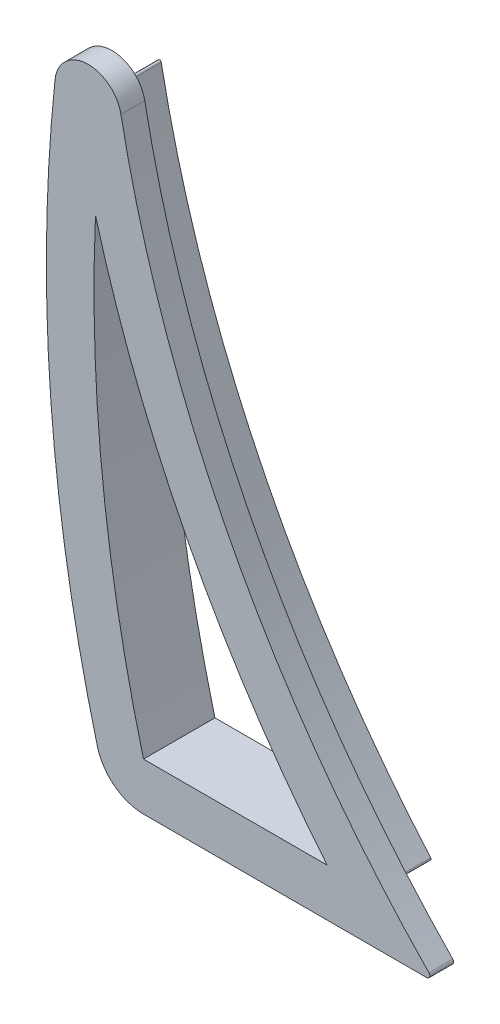
ISO-10303-21;
HEADER;
FILE_DESCRIPTION(('STEP AP214'),'2;1');
FILE_NAME('part.step','',(''),(''),'','','');
FILE_SCHEMA(('AUTOMOTIVE_DESIGN { 1 0 10303 214 1 1 1 1 }'));
ENDSEC;
DATA;
#1=APPLICATION_CONTEXT('core data for automotive mechanical design processes');
#2=APPLICATION_PROTOCOL_DEFINITION('international standard','automotive_design',2000,#1);
#3=PRODUCT_CONTEXT('',#1,'mechanical');
#4=PRODUCT('Part','Part','',(#3));
#5=PRODUCT_RELATED_PRODUCT_CATEGORY('part','',(#4));
#6=PRODUCT_DEFINITION_FORMATION('','',#4);
#7=PRODUCT_DEFINITION_CONTEXT('part definition',#1,'design');
#8=PRODUCT_DEFINITION('design','',#6,#7);
#9=PRODUCT_DEFINITION_SHAPE('','',#8);
#10=(LENGTH_UNIT() NAMED_UNIT(*) SI_UNIT(.MILLI.,.METRE.));
#11=(NAMED_UNIT(*) PLANE_ANGLE_UNIT() SI_UNIT($,.RADIAN.));
#12=(NAMED_UNIT(*) SI_UNIT($,.STERADIAN.) SOLID_ANGLE_UNIT());
#13=UNCERTAINTY_MEASURE_WITH_UNIT(LENGTH_MEASURE(1.E-05),#10,'distance_accuracy_value','');
#14=(GEOMETRIC_REPRESENTATION_CONTEXT(3) GLOBAL_UNCERTAINTY_ASSIGNED_CONTEXT((#13)) GLOBAL_UNIT_ASSIGNED_CONTEXT((#10,
#11,#12)) REPRESENTATION_CONTEXT('',''));
#15=CARTESIAN_POINT('',(0.,0.,0.));
#16=DIRECTION('',(0.,0.,1.));
#17=DIRECTION('',(1.,0.,0.));
#18=AXIS2_PLACEMENT_3D('',#15,#16,#17);
#19=CARTESIAN_POINT('',(65.7323224991207,31.1375568016993,3.));
#20=DIRECTION('',(0.,0.,-1.));
#21=DIRECTION('',(-1.,0.,0.));
#22=AXIS2_PLACEMENT_3D('',#19,#20,#21);
#23=CYLINDRICAL_SURFACE('',#22,75.);
#24=CARTESIAN_POINT('',(65.7323224991207,31.1375568016993,3.));
#25=DIRECTION('',(0.,0.,1.));
#26=DIRECTION('',(1.,0.,0.));
#27=AXIS2_PLACEMENT_3D('',#24,#25,#26);
#28=CIRCLE('',#27,75.);
#29=CARTESIAN_POINT('',(-7.90817231299797,16.9221593810739,3.));
#30=VERTEX_POINT('',#29);
#31=CARTESIAN_POINT('',(9.0550928824167,-17.9816007946541,3.));
#32=VERTEX_POINT('',#31);
#33=EDGE_CURVE('E252',#30,#32,#28,.T.);
#34=ORIENTED_EDGE('',*,*,#33,.T.);
#35=DIRECTION('',(0.,0.,-1.));
#36=VECTOR('',#35,1.);
#37=CARTESIAN_POINT('',(9.05509288241668,-17.9816007946541,3.));
#38=LINE('',#37,#36);
#39=CARTESIAN_POINT('',(9.0550928824167,-17.9816007946541,0.));
#40=VERTEX_POINT('',#39);
#41=EDGE_CURVE('E326',#32,#40,#38,.T.);
#42=ORIENTED_EDGE('',*,*,#41,.T.);
#43=CARTESIAN_POINT('',(65.7323224991207,31.1375568016993,0.));
#44=DIRECTION('',(0.,0.,1.));
#45=DIRECTION('',(1.,0.,0.));
#46=AXIS2_PLACEMENT_3D('',#43,#44,#45);
#47=CIRCLE('',#46,75.);
#48=CARTESIAN_POINT('',(-7.90817231299797,16.9221593810739,0.));
#49=VERTEX_POINT('',#48);
#50=EDGE_CURVE('E275',#49,#40,#47,.T.);
#51=ORIENTED_EDGE('',*,*,#50,.F.);
#52=DIRECTION('',(0.,0.,-1.));
#53=VECTOR('',#52,1.);
#54=CARTESIAN_POINT('',(-7.90817231299798,16.9221593810739,3.));
#55=LINE('',#54,#53);
#56=EDGE_CURVE('E306',#49,#30,#55,.F.);
#57=ORIENTED_EDGE('',*,*,#56,.T.);
#58=EDGE_LOOP('',(#34,#42,#51,#57));
#59=FACE_BOUND('',#58,.T.);
#60=ADVANCED_FACE('F63',(#59),#23,.F.);
#61=CARTESIAN_POINT('',(86.3599558529587,6.85290699521738,3.));
#62=DIRECTION('',(0.,0.,-1.));
#63=DIRECTION('',(-1.,0.,0.));
#64=AXIS2_PLACEMENT_3D('',#61,#62,#63);
#65=CYLINDRICAL_SURFACE('',#64,95.);
#66=CARTESIAN_POINT('',(86.3599558529587,6.85290699521738,3.));
#67=DIRECTION('',(0.,0.,1.));
#68=DIRECTION('',(1.,0.,0.));
#69=AXIS2_PLACEMENT_3D('',#66,#67,#68);
#70=CIRCLE('',#69,95.);
#71=CARTESIAN_POINT('',(-8.1057972742849,16.9137959272485,3.));
#72=VERTEX_POINT('',#71);
#73=CARTESIAN_POINT('',(-5.49144311833216,-17.4024121537188,3.));
#74=VERTEX_POINT('',#73);
#75=EDGE_CURVE('E256',#72,#74,#70,.T.);
#76=ORIENTED_EDGE('',*,*,#75,.F.);
#77=DIRECTION('',(0.,0.,-1.));
#78=VECTOR('',#77,1.);
#79=CARTESIAN_POINT('',(-8.1057972742849,16.9137959272485,3.));
#80=LINE('',#79,#78);
#81=CARTESIAN_POINT('',(-8.1057972742849,16.9137959272485,0.));
#82=VERTEX_POINT('',#81);
#83=EDGE_CURVE('E294',#72,#82,#80,.T.);
#84=ORIENTED_EDGE('',*,*,#83,.T.);
#85=CARTESIAN_POINT('',(86.3599558529587,6.85290699521738,0.));
#86=DIRECTION('',(0.,0.,1.));
#87=DIRECTION('',(1.,0.,0.));
#88=AXIS2_PLACEMENT_3D('',#85,#86,#87);
#89=CIRCLE('',#88,95.);
#90=CARTESIAN_POINT('',(-5.49144311833216,-17.4024121537188,0.));
#91=VERTEX_POINT('',#90);
#92=EDGE_CURVE('E278',#82,#91,#89,.T.);
#93=ORIENTED_EDGE('',*,*,#92,.T.);
#94=DIRECTION('',(0.,0.,-1.));
#95=VECTOR('',#94,1.);
#96=CARTESIAN_POINT('',(-5.49144311833216,-17.4024121537188,3.));
#97=LINE('',#96,#95);
#98=EDGE_CURVE('E291',#74,#91,#97,.T.);
#99=ORIENTED_EDGE('',*,*,#98,.F.);
#100=EDGE_LOOP('',(#76,#84,#93,#99));
#101=FACE_BOUND('',#100,.T.);
#102=ADVANCED_FACE('F347',(#101),#65,.T.);
#103=CARTESIAN_POINT('',(-4.52458628705541,-17.1470930047826,3.));
#104=DIRECTION('',(0.,0.,-1.));
#105=DIRECTION('',(-1.,0.,0.));
#106=AXIS2_PLACEMENT_3D('',#103,#104,#105);
#107=CYLINDRICAL_SURFACE('',#106,0.999999999999999);
#108=CARTESIAN_POINT('',(-4.52458628705541,-17.1470930047826,0.));
#109=DIRECTION('',(0.,0.,1.));
#110=DIRECTION('',(1.,0.,0.));
#111=AXIS2_PLACEMENT_3D('',#108,#109,#110);
#112=CIRCLE('',#111,0.999999999999999);
#113=CARTESIAN_POINT('',(-4.52458628705541,-18.1470930047826,0.));
#114=VERTEX_POINT('',#113);
#115=EDGE_CURVE('E281',#91,#114,#112,.T.);
#116=ORIENTED_EDGE('',*,*,#115,.T.);
#117=DIRECTION('',(0.,0.,-1.));
#118=VECTOR('',#117,1.);
#119=CARTESIAN_POINT('',(-4.52458628705541,-18.1470930047826,3.));
#120=LINE('',#119,#118);
#121=CARTESIAN_POINT('',(-4.52458628705541,-18.1470930047826,3.));
#122=VERTEX_POINT('',#121);
#123=EDGE_CURVE('E287',#122,#114,#120,.T.);
#124=ORIENTED_EDGE('',*,*,#123,.F.);
#125=CARTESIAN_POINT('',(-4.52458628705541,-17.1470930047826,3.));
#126=DIRECTION('',(0.,0.,1.));
#127=DIRECTION('',(1.,0.,0.));
#128=AXIS2_PLACEMENT_3D('',#125,#126,#127);
#129=CIRCLE('',#128,0.999999999999999);
#130=EDGE_CURVE('E261',#74,#122,#129,.T.);
#131=ORIENTED_EDGE('',*,*,#130,.F.);
#132=ORIENTED_EDGE('',*,*,#98,.T.);
#133=EDGE_LOOP('',(#116,#124,#131,#132));
#134=FACE_BOUND('',#133,.T.);
#135=ADVANCED_FACE('F363',(#134),#107,.T.);
#136=CARTESIAN_POINT('',(86.3599558529587,6.85290699521738,3.));
#137=DIRECTION('',(0.,0.,-1.));
#138=DIRECTION('',(-1.,0.,0.));
#139=AXIS2_PLACEMENT_3D('',#136,#137,#138);
#140=CYLINDRICAL_SURFACE('',#139,94.);
#141=CARTESIAN_POINT('',(86.3599558529587,6.85290699521738,0.));
#142=DIRECTION('',(0.,0.,1.));
#143=DIRECTION('',(1.,0.,0.));
#144=AXIS2_PLACEMENT_3D('',#141,#142,#143);
#145=CIRCLE('',#144,94.);
#146=CARTESIAN_POINT('',(-7.54889357039104,10.9915057898128,0.));
#147=VERTEX_POINT('',#146);
#148=CARTESIAN_POINT('',(-4.52458628705541,-17.1470930047826,0.));
#149=VERTEX_POINT('',#148);
#150=EDGE_CURVE('E251',#147,#149,#145,.T.);
#151=ORIENTED_EDGE('',*,*,#150,.F.);
#152=DIRECTION('',(0.,0.,-1.));
#153=VECTOR('',#152,1.);
#154=CARTESIAN_POINT('',(-7.54889357039104,10.9915057898128,3.));
#155=LINE('',#154,#153);
#156=CARTESIAN_POINT('',(-7.54889357039104,10.9915057898128,4.5));
#157=VERTEX_POINT('',#156);
#158=EDGE_CURVE('E187',#157,#147,#155,.T.);
#159=ORIENTED_EDGE('',*,*,#158,.F.);
#160=CARTESIAN_POINT('',(86.3599558529587,6.85290699521738,4.5));
#161=DIRECTION('',(0.,0.,1.));
#162=DIRECTION('',(1.,0.,0.));
#163=AXIS2_PLACEMENT_3D('',#160,#161,#162);
#164=CIRCLE('',#163,94.);
#165=CARTESIAN_POINT('',(-4.52458628705541,-17.1470930047826,4.5));
#166=VERTEX_POINT('',#165);
#167=EDGE_CURVE('E185',#166,#157,#164,.F.);
#168=ORIENTED_EDGE('',*,*,#167,.F.);
#169=DIRECTION('',(0.,0.,-1.));
#170=VECTOR('',#169,1.);
#171=CARTESIAN_POINT('',(-4.52458628705541,-17.1470930047826,3.));
#172=LINE('',#171,#170);
#173=EDGE_CURVE('E169',#166,#149,#172,.T.);
#174=ORIENTED_EDGE('',*,*,#173,.T.);
#175=EDGE_LOOP('',(#151,#159,#168,#174));
#176=FACE_BOUND('',#175,.T.);
#177=ADVANCED_FACE('F186',(#176),#140,.F.);
#178=CARTESIAN_POINT('',(65.7323224991207,31.1375568016993,3.));
#179=DIRECTION('',(0.,0.,-1.));
#180=DIRECTION('',(-1.,0.,0.));
#181=AXIS2_PLACEMENT_3D('',#178,#179,#180);
#182=CYLINDRICAL_SURFACE('',#181,76.);
#183=CARTESIAN_POINT('',(65.7323224991207,31.1375568016993,0.));
#184=DIRECTION('',(0.,0.,1.));
#185=DIRECTION('',(1.,0.,0.));
#186=AXIS2_PLACEMENT_3D('',#183,#184,#185);
#187=CIRCLE('',#186,76.);
#188=CARTESIAN_POINT('',(7.04167083239099,-17.1470930047826,0.));
#189=VERTEX_POINT('',#188);
#190=EDGE_CURVE('E269',#147,#189,#187,.T.);
#191=ORIENTED_EDGE('',*,*,#190,.T.);
#192=DIRECTION('',(0.,0.,-1.));
#193=VECTOR('',#192,1.);
#194=CARTESIAN_POINT('',(7.04167083239099,-17.1470930047826,3.));
#195=LINE('',#194,#193);
#196=CARTESIAN_POINT('',(7.04167083239099,-17.1470930047826,4.5));
#197=VERTEX_POINT('',#196);
#198=EDGE_CURVE('E181',#197,#189,#195,.T.);
#199=ORIENTED_EDGE('',*,*,#198,.F.);
#200=CARTESIAN_POINT('',(65.7323224991207,31.1375568016993,4.5));
#201=DIRECTION('',(0.,0.,1.));
#202=DIRECTION('',(1.,0.,0.));
#203=AXIS2_PLACEMENT_3D('',#200,#201,#202);
#204=CIRCLE('',#203,76.);
#205=EDGE_CURVE('E194',#157,#197,#204,.T.);
#206=ORIENTED_EDGE('',*,*,#205,.F.);
#207=ORIENTED_EDGE('',*,*,#158,.T.);
#208=EDGE_LOOP('',(#191,#199,#206,#207));
#209=FACE_BOUND('',#208,.T.);
#210=ADVANCED_FACE('F370',(#209),#182,.T.);
#211=CARTESIAN_POINT('',(0.,-17.1470930047826,3.));
#212=DIRECTION('',(0.,1.,0.));
#213=DIRECTION('',(0.,0.,1.));
#214=AXIS2_PLACEMENT_3D('',#211,#212,#213);
#215=PLANE('',#214);
#216=DIRECTION('',(1.,0.,0.));
#217=VECTOR('',#216,1.);
#218=CARTESIAN_POINT('',(0.,-17.1470930047826,0.));
#219=LINE('',#218,#217);
#220=EDGE_CURVE('E176',#149,#189,#219,.T.);
#221=ORIENTED_EDGE('',*,*,#220,.F.);
#222=ORIENTED_EDGE('',*,*,#173,.F.);
#223=DIRECTION('',(-1.,0.,0.));
#224=VECTOR('',#223,1.);
#225=CARTESIAN_POINT('',(0.,-17.1470930047826,4.5));
#226=LINE('',#225,#224);
#227=EDGE_CURVE('E173',#197,#166,#226,.T.);
#228=ORIENTED_EDGE('',*,*,#227,.F.);
#229=ORIENTED_EDGE('',*,*,#198,.T.);
#230=EDGE_LOOP('',(#221,#222,#228,#229));
#231=FACE_BOUND('',#230,.T.);
#232=ADVANCED_FACE('F171',(#231),#215,.T.);
#233=CARTESIAN_POINT('',(0.,-18.1470930047826,3.));
#234=DIRECTION('',(0.,1.,0.));
#235=DIRECTION('',(-1.,0.,0.));
#236=AXIS2_PLACEMENT_3D('',#233,#234,#235);
#237=PLANE('',#236);
#238=DIRECTION('',(1.,0.,0.));
#239=VECTOR('',#238,1.);
#240=CARTESIAN_POINT('',(0.,-18.1470930047826,0.));
#241=LINE('',#240,#239);
#242=CARTESIAN_POINT('',(8.97952324292775,-18.1470930047826,0.));
#243=VERTEX_POINT('',#242);
#244=EDGE_CURVE('E257',#114,#243,#241,.T.);
#245=ORIENTED_EDGE('',*,*,#244,.T.);
#246=DIRECTION('',(0.,0.,1.));
#247=VECTOR('',#246,1.);
#248=CARTESIAN_POINT('',(8.97952324292775,-18.1470930047826,3.));
#249=LINE('',#248,#247);
#250=CARTESIAN_POINT('',(8.97952324292775,-18.1470930047826,3.));
#251=VERTEX_POINT('',#250);
#252=EDGE_CURVE('E72',#243,#251,#249,.T.);
#253=ORIENTED_EDGE('',*,*,#252,.T.);
#254=DIRECTION('',(1.,0.,0.));
#255=VECTOR('',#254,1.);
#256=CARTESIAN_POINT('',(0.,-18.1470930047826,3.));
#257=LINE('',#256,#255);
#258=EDGE_CURVE('E182',#122,#251,#257,.T.);
#259=ORIENTED_EDGE('',*,*,#258,.F.);
#260=ORIENTED_EDGE('',*,*,#123,.T.);
#261=EDGE_LOOP('',(#245,#253,#259,#260));
#262=FACE_BOUND('',#261,.T.);
#263=ADVANCED_FACE('F369',(#262),#237,.F.);
#264=CARTESIAN_POINT('',(0.,0.,0.));
#265=DIRECTION('',(0.,0.,1.));
#266=DIRECTION('',(1.,0.,0.));
#267=AXIS2_PLACEMENT_3D('',#264,#265,#266);
#268=PLANE('',#267);
#269=ORIENTED_EDGE('',*,*,#150,.T.);
#270=ORIENTED_EDGE('',*,*,#220,.T.);
#271=ORIENTED_EDGE('',*,*,#190,.F.);
#272=EDGE_LOOP('',(#269,#270,#271));
#273=FACE_BOUND('',#272,.T.);
#274=ORIENTED_EDGE('',*,*,#50,.T.);
#275=CARTESIAN_POINT('',(8.97952324292775,-18.0470930047826,0.));
#276=DIRECTION('',(0.,0.,1.));
#277=DIRECTION('',(1.,0.,0.));
#278=AXIS2_PLACEMENT_3D('',#275,#276,#277);
#279=CIRCLE('',#278,0.1);
#280=EDGE_CURVE('E86',#40,#243,#279,.F.);
#281=ORIENTED_EDGE('',*,*,#280,.T.);
#282=ORIENTED_EDGE('',*,*,#244,.F.);
#283=ORIENTED_EDGE('',*,*,#115,.F.);
#284=ORIENTED_EDGE('',*,*,#92,.F.);
#285=CARTESIAN_POINT('',(-8.00635963941412,16.9032055178464,0.));
#286=DIRECTION('',(0.,0.,1.));
#287=DIRECTION('',(1.,0.,0.));
#288=AXIS2_PLACEMENT_3D('',#285,#286,#287);
#289=CIRCLE('',#288,0.1);
#290=EDGE_CURVE('E303',#82,#49,#289,.F.);
#291=ORIENTED_EDGE('',*,*,#290,.T.);
#292=EDGE_LOOP('',(#274,#281,#282,#283,#284,#291));
#293=FACE_BOUND('',#292,.T.);
#294=ADVANCED_FACE('F339',(#273,#293),#268,.F.);
#295=CARTESIAN_POINT('',(-8.00635963941412,16.9032055178464,3.));
#296=DIRECTION('',(0.,0.,1.));
#297=DIRECTION('',(1.,0.,0.));
#298=AXIS2_PLACEMENT_3D('',#295,#296,#297);
#299=CYLINDRICAL_SURFACE('',#298,0.1);
#300=CARTESIAN_POINT('',(-8.00635963941412,16.9032055178464,3.));
#301=DIRECTION('',(0.,0.,1.));
#302=DIRECTION('',(1.,0.,0.));
#303=AXIS2_PLACEMENT_3D('',#300,#301,#302);
#304=CIRCLE('',#303,0.1);
#305=EDGE_CURVE('E309',#30,#72,#304,.T.);
#306=ORIENTED_EDGE('',*,*,#305,.F.);
#307=ORIENTED_EDGE('',*,*,#56,.F.);
#308=ORIENTED_EDGE('',*,*,#290,.F.);
#309=ORIENTED_EDGE('',*,*,#83,.F.);
#310=EDGE_LOOP('',(#306,#307,#308,#309));
#311=FACE_BOUND('',#310,.T.);
#312=ADVANCED_FACE('F345',(#311),#299,.T.);
#313=CARTESIAN_POINT('',(-8.00635963941412,16.9032055178464,4.5));
#314=DIRECTION('',(0.,0.,-1.));
#315=DIRECTION('',(-1.,0.,0.));
#316=AXIS2_PLACEMENT_3D('',#313,#314,#315);
#317=CYLINDRICAL_SURFACE('',#316,2.1);
#318=CARTESIAN_POINT('',(-8.00635963941412,16.9032055178464,3.));
#319=DIRECTION('',(0.,0.,1.));
#320=DIRECTION('',(1.,0.,0.));
#321=AXIS2_PLACEMENT_3D('',#318,#319,#320);
#322=CIRCLE('',#321,2.1);
#323=CARTESIAN_POINT('',(-5.9444257846748,17.301236645624,3.));
#324=VERTEX_POINT('',#323);
#325=CARTESIAN_POINT('',(-10.0945499717006,17.1256041152913,3.));
#326=VERTEX_POINT('',#325);
#327=EDGE_CURVE('E198',#324,#326,#322,.T.);
#328=ORIENTED_EDGE('',*,*,#327,.T.);
#329=DIRECTION('',(0.,0.,-1.));
#330=VECTOR('',#329,1.);
#331=CARTESIAN_POINT('',(-10.0945499717006,17.1256041152913,4.5));
#332=LINE('',#331,#330);
#333=CARTESIAN_POINT('',(-10.0945499717006,17.1256041152913,4.5));
#334=VERTEX_POINT('',#333);
#335=EDGE_CURVE('E247',#334,#326,#332,.T.);
#336=ORIENTED_EDGE('',*,*,#335,.F.);
#337=CARTESIAN_POINT('',(-8.00635963941412,16.9032055178464,4.5));
#338=DIRECTION('',(0.,0.,1.));
#339=DIRECTION('',(1.,0.,0.));
#340=AXIS2_PLACEMENT_3D('',#337,#338,#339);
#341=CIRCLE('',#340,2.1);
#342=CARTESIAN_POINT('',(-5.9444257846748,17.301236645624,4.5));
#343=VERTEX_POINT('',#342);
#344=EDGE_CURVE('E201',#343,#334,#341,.T.);
#345=ORIENTED_EDGE('',*,*,#344,.F.);
#346=DIRECTION('',(0.,0.,-1.));
#347=VECTOR('',#346,1.);
#348=CARTESIAN_POINT('',(-5.9444257846748,17.301236645624,4.5));
#349=LINE('',#348,#347);
#350=EDGE_CURVE('E220',#343,#324,#349,.T.);
#351=ORIENTED_EDGE('',*,*,#350,.T.);
#352=EDGE_LOOP('',(#328,#336,#345,#351));
#353=FACE_BOUND('',#352,.T.);
#354=ADVANCED_FACE('F377',(#353),#317,.T.);
#355=CARTESIAN_POINT('',(86.3599558529587,6.85290699521738,4.5));
#356=DIRECTION('',(0.,0.,-1.));
#357=DIRECTION('',(-1.,0.,0.));
#358=AXIS2_PLACEMENT_3D('',#355,#356,#357);
#359=CYLINDRICAL_SURFACE('',#358,97.);
#360=CARTESIAN_POINT('',(86.3599558529587,6.85290699521738,3.));
#361=DIRECTION('',(0.,0.,1.));
#362=DIRECTION('',(1.,0.,0.));
#363=AXIS2_PLACEMENT_3D('',#360,#361,#362);
#364=CIRCLE('',#363,97.);
#365=CARTESIAN_POINT('',(-7.42515678088566,-17.9130504515911,3.));
#366=VERTEX_POINT('',#365);
#367=EDGE_CURVE('E224',#326,#366,#364,.T.);
#368=ORIENTED_EDGE('',*,*,#367,.T.);
#369=DIRECTION('',(0.,0.,-1.));
#370=VECTOR('',#369,1.);
#371=CARTESIAN_POINT('',(-7.42515678088566,-17.9130504515911,4.5));
#372=LINE('',#371,#370);
#373=CARTESIAN_POINT('',(-7.42515678088566,-17.9130504515911,4.5));
#374=VERTEX_POINT('',#373);
#375=EDGE_CURVE('E243',#374,#366,#372,.T.);
#376=ORIENTED_EDGE('',*,*,#375,.F.);
#377=CARTESIAN_POINT('',(86.3599558529587,6.85290699521738,4.5));
#378=DIRECTION('',(0.,0.,1.));
#379=DIRECTION('',(1.,0.,0.));
#380=AXIS2_PLACEMENT_3D('',#377,#378,#379);
#381=CIRCLE('',#380,97.);
#382=EDGE_CURVE('E205',#334,#374,#381,.T.);
#383=ORIENTED_EDGE('',*,*,#382,.F.);
#384=ORIENTED_EDGE('',*,*,#335,.T.);
#385=EDGE_LOOP('',(#368,#376,#383,#384));
#386=FACE_BOUND('',#385,.T.);
#387=ADVANCED_FACE('F382',(#386),#359,.T.);
#388=CARTESIAN_POINT('',(-4.52458628705541,-17.1470930047826,4.5));
#389=DIRECTION('',(0.,0.,-1.));
#390=DIRECTION('',(-1.,0.,0.));
#391=AXIS2_PLACEMENT_3D('',#388,#389,#390);
#392=CYLINDRICAL_SURFACE('',#391,3.);
#393=CARTESIAN_POINT('',(-4.52458628705541,-17.1470930047826,3.));
#394=DIRECTION('',(0.,0.,1.));
#395=DIRECTION('',(1.,0.,0.));
#396=AXIS2_PLACEMENT_3D('',#393,#394,#395);
#397=CIRCLE('',#396,3.);
#398=CARTESIAN_POINT('',(-4.52458628705542,-20.1470930047826,3.));
#399=VERTEX_POINT('',#398);
#400=EDGE_CURVE('E227',#366,#399,#397,.T.);
#401=ORIENTED_EDGE('',*,*,#400,.T.);
#402=DIRECTION('',(0.,0.,-1.));
#403=VECTOR('',#402,1.);
#404=CARTESIAN_POINT('',(-4.52458628705542,-20.1470930047826,4.5));
#405=LINE('',#404,#403);
#406=CARTESIAN_POINT('',(-4.52458628705542,-20.1470930047826,4.5));
#407=VERTEX_POINT('',#406);
#408=EDGE_CURVE('E239',#407,#399,#405,.T.);
#409=ORIENTED_EDGE('',*,*,#408,.F.);
#410=CARTESIAN_POINT('',(-4.52458628705541,-17.1470930047826,4.5));
#411=DIRECTION('',(0.,0.,1.));
#412=DIRECTION('',(1.,0.,0.));
#413=AXIS2_PLACEMENT_3D('',#410,#411,#412);
#414=CIRCLE('',#413,3.);
#415=EDGE_CURVE('E209',#374,#407,#414,.T.);
#416=ORIENTED_EDGE('',*,*,#415,.F.);
#417=ORIENTED_EDGE('',*,*,#375,.T.);
#418=EDGE_LOOP('',(#401,#409,#416,#417));
#419=FACE_BOUND('',#418,.T.);
#420=ADVANCED_FACE('F469',(#419),#392,.T.);
#421=CARTESIAN_POINT('',(-4.52458628705542,-20.1470930047826,4.5));
#422=DIRECTION('',(0.,1.,0.));
#423=DIRECTION('',(-1.,0.,0.));
#424=AXIS2_PLACEMENT_3D('',#421,#422,#423);
#425=PLANE('',#424);
#426=DIRECTION('',(1.,0.,0.));
#427=VECTOR('',#426,1.);
#428=CARTESIAN_POINT('',(-4.52458628705542,-20.1470930047826,3.));
#429=LINE('',#428,#427);
#430=CARTESIAN_POINT('',(13.3052440553517,-20.1470930047826,3.));
#431=VERTEX_POINT('',#430);
#432=EDGE_CURVE('E230',#399,#431,#429,.T.);
#433=ORIENTED_EDGE('',*,*,#432,.T.);
#434=DIRECTION('',(0.,0.,1.));
#435=VECTOR('',#434,1.);
#436=CARTESIAN_POINT('',(13.3052440553517,-20.1470930047826,4.5));
#437=LINE('',#436,#435);
#438=CARTESIAN_POINT('',(13.3052440553517,-20.1470930047826,4.5));
#439=VERTEX_POINT('',#438);
#440=EDGE_CURVE('E320',#431,#439,#437,.T.);
#441=ORIENTED_EDGE('',*,*,#440,.T.);
#442=DIRECTION('',(1.,0.,0.));
#443=VECTOR('',#442,1.);
#444=CARTESIAN_POINT('',(-4.52458628705542,-20.1470930047826,4.5));
#445=LINE('',#444,#443);
#446=EDGE_CURVE('E212',#407,#439,#445,.T.);
#447=ORIENTED_EDGE('',*,*,#446,.F.);
#448=ORIENTED_EDGE('',*,*,#408,.T.);
#449=EDGE_LOOP('',(#433,#441,#447,#448));
#450=FACE_BOUND('',#449,.T.);
#451=ADVANCED_FACE('F459',(#450),#425,.F.);
#452=CARTESIAN_POINT('',(65.7323224991207,31.1375568016993,4.5));
#453=DIRECTION('',(0.,0.,-1.));
#454=DIRECTION('',(-1.,0.,0.));
#455=AXIS2_PLACEMENT_3D('',#452,#453,#454);
#456=CYLINDRICAL_SURFACE('',#455,73.);
#457=CARTESIAN_POINT('',(65.7323224991207,31.1375568016993,4.5));
#458=DIRECTION('',(0.,0.,1.));
#459=DIRECTION('',(1.,0.,0.));
#460=AXIS2_PLACEMENT_3D('',#457,#458,#459);
#461=CIRCLE('',#460,73.);
#462=CARTESIAN_POINT('',(13.4484874390779,-19.8075174588633,4.5));
#463=VERTEX_POINT('',#462);
#464=EDGE_CURVE('E216',#343,#463,#461,.T.);
#465=ORIENTED_EDGE('',*,*,#464,.T.);
#466=DIRECTION('',(0.,0.,-1.));
#467=VECTOR('',#466,1.);
#468=CARTESIAN_POINT('',(13.4484874390779,-19.8075174588633,4.5));
#469=LINE('',#468,#467);
#470=CARTESIAN_POINT('',(13.4484874390779,-19.8075174588633,3.));
#471=VERTEX_POINT('',#470);
#472=EDGE_CURVE('E313',#463,#471,#469,.T.);
#473=ORIENTED_EDGE('',*,*,#472,.T.);
#474=CARTESIAN_POINT('',(65.7323224991207,31.1375568016993,3.));
#475=DIRECTION('',(0.,0.,1.));
#476=DIRECTION('',(1.,0.,0.));
#477=AXIS2_PLACEMENT_3D('',#474,#475,#476);
#478=CIRCLE('',#477,73.);
#479=EDGE_CURVE('E206',#324,#471,#478,.T.);
#480=ORIENTED_EDGE('',*,*,#479,.F.);
#481=ORIENTED_EDGE('',*,*,#350,.F.);
#482=EDGE_LOOP('',(#465,#473,#480,#481));
#483=FACE_BOUND('',#482,.T.);
#484=ADVANCED_FACE('F450',(#483),#456,.F.);
#485=CARTESIAN_POINT('',(-8.00635963941412,16.9032055178464,4.5));
#486=DIRECTION('',(0.,0.,1.));
#487=DIRECTION('',(1.,0.,0.));
#488=AXIS2_PLACEMENT_3D('',#485,#486,#487);
#489=PLANE('',#488);
#490=ORIENTED_EDGE('',*,*,#167,.T.);
#491=ORIENTED_EDGE('',*,*,#205,.T.);
#492=ORIENTED_EDGE('',*,*,#227,.T.);
#493=EDGE_LOOP('',(#490,#491,#492));
#494=FACE_BOUND('',#493,.T.);
#495=ORIENTED_EDGE('',*,*,#446,.T.);
#496=CARTESIAN_POINT('',(13.3052440553517,-19.9470930047826,4.5));
#497=DIRECTION('',(0.,0.,1.));
#498=DIRECTION('',(1.,0.,0.));
#499=AXIS2_PLACEMENT_3D('',#496,#497,#498);
#500=CIRCLE('',#499,0.2);
#501=EDGE_CURVE('E323',#439,#463,#500,.T.);
#502=ORIENTED_EDGE('',*,*,#501,.T.);
#503=ORIENTED_EDGE('',*,*,#464,.F.);
#504=ORIENTED_EDGE('',*,*,#344,.T.);
#505=ORIENTED_EDGE('',*,*,#382,.T.);
#506=ORIENTED_EDGE('',*,*,#415,.T.);
#507=EDGE_LOOP('',(#495,#502,#503,#504,#505,#506));
#508=FACE_BOUND('',#507,.T.);
#509=ADVANCED_FACE('F192',(#494,#508),#489,.T.);
#510=CARTESIAN_POINT('',(-8.00635963941412,16.9032055178464,3.));
#511=DIRECTION('',(0.,0.,1.));
#512=DIRECTION('',(1.,0.,0.));
#513=AXIS2_PLACEMENT_3D('',#510,#511,#512);
#514=PLANE('',#513);
#515=ORIENTED_EDGE('',*,*,#33,.F.);
#516=ORIENTED_EDGE('',*,*,#305,.T.);
#517=ORIENTED_EDGE('',*,*,#75,.T.);
#518=ORIENTED_EDGE('',*,*,#130,.T.);
#519=ORIENTED_EDGE('',*,*,#258,.T.);
#520=CARTESIAN_POINT('',(8.97952324292775,-18.0470930047826,3.));
#521=DIRECTION('',(0.,0.,1.));
#522=DIRECTION('',(1.,0.,0.));
#523=AXIS2_PLACEMENT_3D('',#520,#521,#522);
#524=CIRCLE('',#523,0.1);
#525=EDGE_CURVE('E12',#251,#32,#524,.T.);
#526=ORIENTED_EDGE('',*,*,#525,.T.);
#527=EDGE_LOOP('',(#515,#516,#517,#518,#519,#526));
#528=FACE_BOUND('',#527,.T.);
#529=ORIENTED_EDGE('',*,*,#479,.T.);
#530=CARTESIAN_POINT('',(13.3052440553517,-19.9470930047826,3.));
#531=DIRECTION('',(0.,0.,1.));
#532=DIRECTION('',(1.,0.,0.));
#533=AXIS2_PLACEMENT_3D('',#530,#531,#532);
#534=CIRCLE('',#533,0.2);
#535=EDGE_CURVE('E317',#471,#431,#534,.F.);
#536=ORIENTED_EDGE('',*,*,#535,.T.);
#537=ORIENTED_EDGE('',*,*,#432,.F.);
#538=ORIENTED_EDGE('',*,*,#400,.F.);
#539=ORIENTED_EDGE('',*,*,#367,.F.);
#540=ORIENTED_EDGE('',*,*,#327,.F.);
#541=EDGE_LOOP('',(#529,#536,#537,#538,#539,#540));
#542=FACE_BOUND('',#541,.T.);
#543=ADVANCED_FACE('F350',(#528,#542),#514,.F.);
#544=CARTESIAN_POINT('',(13.3052440553517,-19.9470930047826,4.5));
#545=DIRECTION('',(0.,0.,-1.));
#546=DIRECTION('',(-1.,0.,0.));
#547=AXIS2_PLACEMENT_3D('',#544,#545,#546);
#548=CYLINDRICAL_SURFACE('',#547,0.2);
#549=ORIENTED_EDGE('',*,*,#501,.F.);
#550=ORIENTED_EDGE('',*,*,#440,.F.);
#551=ORIENTED_EDGE('',*,*,#535,.F.);
#552=ORIENTED_EDGE('',*,*,#472,.F.);
#553=EDGE_LOOP('',(#549,#550,#551,#552));
#554=FACE_BOUND('',#553,.T.);
#555=ADVANCED_FACE('F353',(#554),#548,.T.);
#556=CARTESIAN_POINT('',(8.97952324292775,-18.0470930047826,3.));
#557=DIRECTION('',(0.,0.,-1.));
#558=DIRECTION('',(-1.,0.,0.));
#559=AXIS2_PLACEMENT_3D('',#556,#557,#558);
#560=CYLINDRICAL_SURFACE('',#559,0.1);
#561=ORIENTED_EDGE('',*,*,#525,.F.);
#562=ORIENTED_EDGE('',*,*,#252,.F.);
#563=ORIENTED_EDGE('',*,*,#280,.F.);
#564=ORIENTED_EDGE('',*,*,#41,.F.);
#565=EDGE_LOOP('',(#561,#562,#563,#564));
#566=FACE_BOUND('',#565,.T.);
#567=ADVANCED_FACE('F65',(#566),#560,.T.);
#568=CLOSED_SHELL('',(#60,#102,#135,#177,#210,#232,#263,#294,#312,#354,#387,#420,#451,#484,#509,
#543,#555,#567));
#569=MANIFOLD_SOLID_BREP('B2',#568);
#570=ADVANCED_BREP_SHAPE_REPRESENTATION('',(#18,#569),#14);
#571=SHAPE_DEFINITION_REPRESENTATION(#9,#570);
ENDSEC;
END-ISO-10303-21;
